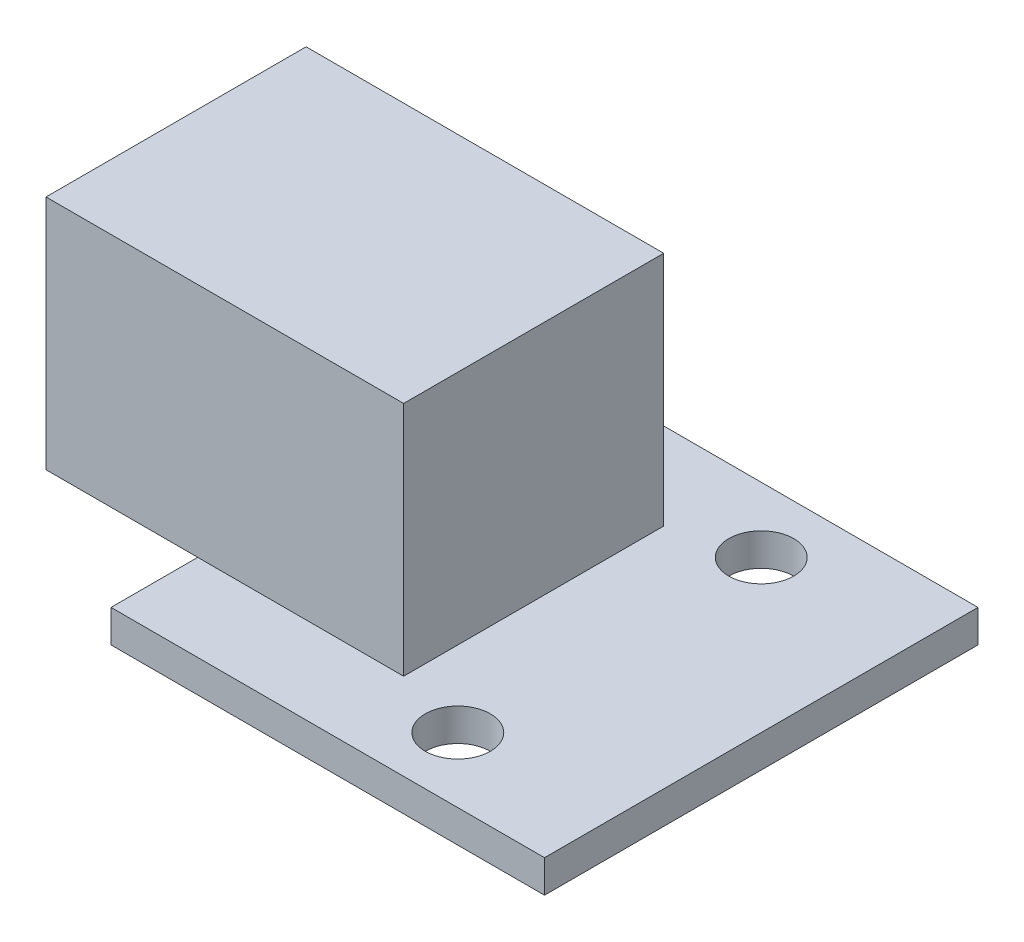
ISO-10303-21;
HEADER;
FILE_DESCRIPTION(('STEP AP214'),'2;1');
FILE_NAME('part.step','',(''),(''),'','','');
FILE_SCHEMA(('AUTOMOTIVE_DESIGN { 1 0 10303 214 1 1 1 1 }'));
ENDSEC;
DATA;
#1=APPLICATION_CONTEXT('core data for automotive mechanical design processes');
#2=APPLICATION_PROTOCOL_DEFINITION('international standard','automotive_design',2000,#1);
#3=PRODUCT_CONTEXT('',#1,'mechanical');
#4=PRODUCT('Part','Part','',(#3));
#5=PRODUCT_RELATED_PRODUCT_CATEGORY('part','',(#4));
#6=PRODUCT_DEFINITION_FORMATION('','',#4);
#7=PRODUCT_DEFINITION_CONTEXT('part definition',#1,'design');
#8=PRODUCT_DEFINITION('design','',#6,#7);
#9=PRODUCT_DEFINITION_SHAPE('','',#8);
#10=(LENGTH_UNIT() NAMED_UNIT(*) SI_UNIT(.MILLI.,.METRE.));
#11=(NAMED_UNIT(*) PLANE_ANGLE_UNIT() SI_UNIT($,.RADIAN.));
#12=(NAMED_UNIT(*) SI_UNIT($,.STERADIAN.) SOLID_ANGLE_UNIT());
#13=UNCERTAINTY_MEASURE_WITH_UNIT(LENGTH_MEASURE(1.E-05),#10,'distance_accuracy_value','');
#14=(GEOMETRIC_REPRESENTATION_CONTEXT(3) GLOBAL_UNCERTAINTY_ASSIGNED_CONTEXT((#13)) GLOBAL_UNIT_ASSIGNED_CONTEXT((#10,
#11,#12)) REPRESENTATION_CONTEXT('',''));
#15=CARTESIAN_POINT('',(0.,0.,0.));
#16=DIRECTION('',(0.,0.,1.));
#17=DIRECTION('',(1.,0.,0.));
#18=AXIS2_PLACEMENT_3D('',#15,#16,#17);
#19=CARTESIAN_POINT('',(0.,1.5,0.));
#20=DIRECTION('',(0.,-1.,0.));
#21=DIRECTION('',(0.,0.,-1.));
#22=AXIS2_PLACEMENT_3D('',#19,#20,#21);
#23=PLANE('',#22);
#24=CARTESIAN_POINT('',(3.,1.5,7.));
#25=DIRECTION('',(0.,1.,0.));
#26=DIRECTION('',(0.,0.,1.));
#27=AXIS2_PLACEMENT_3D('',#24,#25,#26);
#28=CIRCLE('',#27,1.5);
#29=CARTESIAN_POINT('',(3.,1.5,8.5));
#30=VERTEX_POINT('',#29);
#31=EDGE_CURVE('E128',#30,#30,#28,.T.);
#32=ORIENTED_EDGE('',*,*,#31,.F.);
#33=EDGE_LOOP('',(#32));
#34=FACE_BOUND('',#33,.T.);
#35=CARTESIAN_POINT('',(3.,1.5,-7.));
#36=DIRECTION('',(0.,1.,0.));
#37=DIRECTION('',(0.,0.,1.));
#38=AXIS2_PLACEMENT_3D('',#35,#36,#37);
#39=CIRCLE('',#38,1.5);
#40=CARTESIAN_POINT('',(3.,1.5,-5.5));
#41=VERTEX_POINT('',#40);
#42=EDGE_CURVE('E137',#41,#41,#39,.T.);
#43=ORIENTED_EDGE('',*,*,#42,.F.);
#44=EDGE_LOOP('',(#43));
#45=FACE_BOUND('',#44,.T.);
#46=DIRECTION('',(1.,0.,0.));
#47=VECTOR('',#46,1.);
#48=CARTESIAN_POINT('',(-17.,1.5,6.));
#49=LINE('',#48,#47);
#50=CARTESIAN_POINT('',(-10.,1.5,6.));
#51=VERTEX_POINT('',#50);
#52=CARTESIAN_POINT('',(-0.5,1.5,6.));
#53=VERTEX_POINT('',#52);
#54=EDGE_CURVE('E11',#51,#53,#49,.T.);
#55=ORIENTED_EDGE('',*,*,#54,.F.);
#56=DIRECTION('',(0.,0.,1.));
#57=VECTOR('',#56,1.);
#58=CARTESIAN_POINT('',(-10.,1.5,10.));
#59=LINE('',#58,#57);
#60=CARTESIAN_POINT('',(-10.,1.5,10.));
#61=VERTEX_POINT('',#60);
#62=EDGE_CURVE('E149',#51,#61,#59,.T.);
#63=ORIENTED_EDGE('',*,*,#62,.T.);
#64=DIRECTION('',(1.,0.,0.));
#65=VECTOR('',#64,1.);
#66=CARTESIAN_POINT('',(-10.,1.5,10.));
#67=LINE('',#66,#65);
#68=CARTESIAN_POINT('',(10.,1.5,10.));
#69=VERTEX_POINT('',#68);
#70=EDGE_CURVE('E152',#61,#69,#67,.T.);
#71=ORIENTED_EDGE('',*,*,#70,.T.);
#72=DIRECTION('',(0.,0.,-1.));
#73=VECTOR('',#72,1.);
#74=CARTESIAN_POINT('',(10.,1.5,10.));
#75=LINE('',#74,#73);
#76=CARTESIAN_POINT('',(10.,1.5,-10.));
#77=VERTEX_POINT('',#76);
#78=EDGE_CURVE('E143',#69,#77,#75,.T.);
#79=ORIENTED_EDGE('',*,*,#78,.T.);
#80=DIRECTION('',(-1.,0.,0.));
#81=VECTOR('',#80,1.);
#82=CARTESIAN_POINT('',(-10.,1.5,-10.));
#83=LINE('',#82,#81);
#84=CARTESIAN_POINT('',(-10.,1.5,-10.));
#85=VERTEX_POINT('',#84);
#86=EDGE_CURVE('E146',#77,#85,#83,.T.);
#87=ORIENTED_EDGE('',*,*,#86,.T.);
#88=CARTESIAN_POINT('',(-10.,1.5,-6.));
#89=VERTEX_POINT('',#88);
#90=EDGE_CURVE('E150',#85,#89,#59,.T.);
#91=ORIENTED_EDGE('',*,*,#90,.T.);
#92=DIRECTION('',(-1.,0.,0.));
#93=VECTOR('',#92,1.);
#94=CARTESIAN_POINT('',(-17.,1.5,-6.));
#95=LINE('',#94,#93);
#96=CARTESIAN_POINT('',(-0.5,1.5,-6.));
#97=VERTEX_POINT('',#96);
#98=EDGE_CURVE('E55',#97,#89,#95,.T.);
#99=ORIENTED_EDGE('',*,*,#98,.F.);
#100=DIRECTION('',(0.,0.,-1.));
#101=VECTOR('',#100,1.);
#102=CARTESIAN_POINT('',(-0.5,1.5,6.));
#103=LINE('',#102,#101);
#104=EDGE_CURVE('E51',#53,#97,#103,.T.);
#105=ORIENTED_EDGE('',*,*,#104,.F.);
#106=EDGE_LOOP('',(#55,#63,#71,#79,#87,#91,#99,#105));
#107=FACE_BOUND('',#106,.T.);
#108=ADVANCED_FACE('F34',(#34,#45,#107),#23,.F.);
#109=CARTESIAN_POINT('',(0.,0.,0.));
#110=DIRECTION('',(0.,-1.,0.));
#111=DIRECTION('',(0.,0.,-1.));
#112=AXIS2_PLACEMENT_3D('',#109,#110,#111);
#113=PLANE('',#112);
#114=CARTESIAN_POINT('',(3.,0.,-7.));
#115=DIRECTION('',(0.,1.,0.));
#116=DIRECTION('',(0.,0.,1.));
#117=AXIS2_PLACEMENT_3D('',#114,#115,#116);
#118=CIRCLE('',#117,1.5);
#119=CARTESIAN_POINT('',(3.,0.,-5.5));
#120=VERTEX_POINT('',#119);
#121=EDGE_CURVE('E135',#120,#120,#118,.T.);
#122=ORIENTED_EDGE('',*,*,#121,.T.);
#123=EDGE_LOOP('',(#122));
#124=FACE_BOUND('',#123,.T.);
#125=DIRECTION('',(0.,0.,-1.));
#126=VECTOR('',#125,1.);
#127=CARTESIAN_POINT('',(10.,0.,10.));
#128=LINE('',#127,#126);
#129=CARTESIAN_POINT('',(10.,0.,10.));
#130=VERTEX_POINT('',#129);
#131=CARTESIAN_POINT('',(10.,0.,-10.));
#132=VERTEX_POINT('',#131);
#133=EDGE_CURVE('E140',#130,#132,#128,.T.);
#134=ORIENTED_EDGE('',*,*,#133,.F.);
#135=DIRECTION('',(1.,0.,0.));
#136=VECTOR('',#135,1.);
#137=CARTESIAN_POINT('',(-10.,0.,10.));
#138=LINE('',#137,#136);
#139=CARTESIAN_POINT('',(-10.,0.,10.));
#140=VERTEX_POINT('',#139);
#141=EDGE_CURVE('E147',#140,#130,#138,.T.);
#142=ORIENTED_EDGE('',*,*,#141,.F.);
#143=DIRECTION('',(0.,0.,1.));
#144=VECTOR('',#143,1.);
#145=CARTESIAN_POINT('',(-10.,0.,10.));
#146=LINE('',#145,#144);
#147=CARTESIAN_POINT('',(-10.,0.,-10.));
#148=VERTEX_POINT('',#147);
#149=EDGE_CURVE('E160',#148,#140,#146,.T.);
#150=ORIENTED_EDGE('',*,*,#149,.F.);
#151=DIRECTION('',(-1.,0.,0.));
#152=VECTOR('',#151,1.);
#153=CARTESIAN_POINT('',(-10.,0.,-10.));
#154=LINE('',#153,#152);
#155=EDGE_CURVE('E158',#132,#148,#154,.T.);
#156=ORIENTED_EDGE('',*,*,#155,.F.);
#157=EDGE_LOOP('',(#134,#142,#150,#156));
#158=FACE_BOUND('',#157,.T.);
#159=CARTESIAN_POINT('',(3.,0.,7.));
#160=DIRECTION('',(0.,1.,0.));
#161=DIRECTION('',(0.,0.,1.));
#162=AXIS2_PLACEMENT_3D('',#159,#160,#161);
#163=CIRCLE('',#162,1.5);
#164=CARTESIAN_POINT('',(3.,0.,8.5));
#165=VERTEX_POINT('',#164);
#166=EDGE_CURVE('E125',#165,#165,#163,.T.);
#167=ORIENTED_EDGE('',*,*,#166,.T.);
#168=EDGE_LOOP('',(#167));
#169=FACE_BOUND('',#168,.T.);
#170=ADVANCED_FACE('F183',(#124,#158,#169),#113,.T.);
#171=CARTESIAN_POINT('',(10.,1.5,10.));
#172=DIRECTION('',(-1.,0.,0.));
#173=DIRECTION('',(0.,0.,1.));
#174=AXIS2_PLACEMENT_3D('',#171,#172,#173);
#175=PLANE('',#174);
#176=ORIENTED_EDGE('',*,*,#133,.T.);
#177=DIRECTION('',(0.,-1.,0.));
#178=VECTOR('',#177,1.);
#179=CARTESIAN_POINT('',(10.,1.5,-10.));
#180=LINE('',#179,#178);
#181=EDGE_CURVE('E38',#77,#132,#180,.T.);
#182=ORIENTED_EDGE('',*,*,#181,.F.);
#183=ORIENTED_EDGE('',*,*,#78,.F.);
#184=DIRECTION('',(0.,-1.,0.));
#185=VECTOR('',#184,1.);
#186=CARTESIAN_POINT('',(10.,1.5,10.));
#187=LINE('',#186,#185);
#188=EDGE_CURVE('E155',#69,#130,#187,.T.);
#189=ORIENTED_EDGE('',*,*,#188,.T.);
#190=EDGE_LOOP('',(#176,#182,#183,#189));
#191=FACE_BOUND('',#190,.T.);
#192=ADVANCED_FACE('F36',(#191),#175,.F.);
#193=CARTESIAN_POINT('',(-10.,1.5,-10.));
#194=DIRECTION('',(0.,0.,1.));
#195=DIRECTION('',(1.,0.,0.));
#196=AXIS2_PLACEMENT_3D('',#193,#194,#195);
#197=PLANE('',#196);
#198=ORIENTED_EDGE('',*,*,#155,.T.);
#199=DIRECTION('',(0.,-1.,0.));
#200=VECTOR('',#199,1.);
#201=CARTESIAN_POINT('',(-10.,1.5,-10.));
#202=LINE('',#201,#200);
#203=EDGE_CURVE('E167',#85,#148,#202,.T.);
#204=ORIENTED_EDGE('',*,*,#203,.F.);
#205=ORIENTED_EDGE('',*,*,#86,.F.);
#206=ORIENTED_EDGE('',*,*,#181,.T.);
#207=EDGE_LOOP('',(#198,#204,#205,#206));
#208=FACE_BOUND('',#207,.T.);
#209=ADVANCED_FACE('F176',(#208),#197,.F.);
#210=CARTESIAN_POINT('',(-10.,1.5,10.));
#211=DIRECTION('',(1.,0.,0.));
#212=DIRECTION('',(0.,0.,-1.));
#213=AXIS2_PLACEMENT_3D('',#210,#211,#212);
#214=PLANE('',#213);
#215=ORIENTED_EDGE('',*,*,#149,.T.);
#216=DIRECTION('',(0.,-1.,0.));
#217=VECTOR('',#216,1.);
#218=CARTESIAN_POINT('',(-10.,1.5,10.));
#219=LINE('',#218,#217);
#220=EDGE_CURVE('E165',#61,#140,#219,.T.);
#221=ORIENTED_EDGE('',*,*,#220,.F.);
#222=ORIENTED_EDGE('',*,*,#62,.F.);
#223=EDGE_CURVE('E153',#89,#51,#59,.T.);
#224=ORIENTED_EDGE('',*,*,#223,.F.);
#225=ORIENTED_EDGE('',*,*,#90,.F.);
#226=ORIENTED_EDGE('',*,*,#203,.T.);
#227=EDGE_LOOP('',(#215,#221,#222,#224,#225,#226));
#228=FACE_BOUND('',#227,.T.);
#229=ADVANCED_FACE('F186',(#228),#214,.F.);
#230=CARTESIAN_POINT('',(-10.,1.5,10.));
#231=DIRECTION('',(0.,0.,-1.));
#232=DIRECTION('',(-1.,0.,0.));
#233=AXIS2_PLACEMENT_3D('',#230,#231,#232);
#234=PLANE('',#233);
#235=ORIENTED_EDGE('',*,*,#141,.T.);
#236=ORIENTED_EDGE('',*,*,#188,.F.);
#237=ORIENTED_EDGE('',*,*,#70,.F.);
#238=ORIENTED_EDGE('',*,*,#220,.T.);
#239=EDGE_LOOP('',(#235,#236,#237,#238));
#240=FACE_BOUND('',#239,.T.);
#241=ADVANCED_FACE('F190',(#240),#234,.F.);
#242=CARTESIAN_POINT('',(3.,1.5,-7.));
#243=DIRECTION('',(0.,-1.,0.));
#244=DIRECTION('',(0.,0.,-1.));
#245=AXIS2_PLACEMENT_3D('',#242,#243,#244);
#246=CYLINDRICAL_SURFACE('',#245,1.5);
#247=ORIENTED_EDGE('',*,*,#42,.T.);
#248=EDGE_LOOP('',(#247));
#249=FACE_BOUND('',#248,.T.);
#250=ORIENTED_EDGE('',*,*,#121,.F.);
#251=EDGE_LOOP('',(#250));
#252=FACE_BOUND('',#251,.T.);
#253=ADVANCED_FACE('F233',(#249,#252),#246,.F.);
#254=CARTESIAN_POINT('',(3.,1.5,7.));
#255=DIRECTION('',(0.,-1.,0.));
#256=DIRECTION('',(0.,0.,-1.));
#257=AXIS2_PLACEMENT_3D('',#254,#255,#256);
#258=CYLINDRICAL_SURFACE('',#257,1.5);
#259=ORIENTED_EDGE('',*,*,#31,.T.);
#260=EDGE_LOOP('',(#259));
#261=FACE_BOUND('',#260,.T.);
#262=ORIENTED_EDGE('',*,*,#166,.F.);
#263=EDGE_LOOP('',(#262));
#264=FACE_BOUND('',#263,.T.);
#265=ADVANCED_FACE('F276',(#261,#264),#258,.F.);
#266=CARTESIAN_POINT('',(-0.5,12.4,6.));
#267=DIRECTION('',(-1.,0.,0.));
#268=DIRECTION('',(0.,0.,1.));
#269=AXIS2_PLACEMENT_3D('',#266,#267,#268);
#270=PLANE('',#269);
#271=ORIENTED_EDGE('',*,*,#104,.T.);
#272=DIRECTION('',(0.,-1.,0.));
#273=VECTOR('',#272,1.);
#274=CARTESIAN_POINT('',(-0.5,12.4,-6.));
#275=LINE('',#274,#273);
#276=CARTESIAN_POINT('',(-0.5,12.4,-6.));
#277=VERTEX_POINT('',#276);
#278=EDGE_CURVE('E108',#277,#97,#275,.T.);
#279=ORIENTED_EDGE('',*,*,#278,.F.);
#280=DIRECTION('',(0.,0.,-1.));
#281=VECTOR('',#280,1.);
#282=CARTESIAN_POINT('',(-0.5,12.4,6.));
#283=LINE('',#282,#281);
#284=CARTESIAN_POINT('',(-0.5,12.4,6.));
#285=VERTEX_POINT('',#284);
#286=EDGE_CURVE('E114',#285,#277,#283,.T.);
#287=ORIENTED_EDGE('',*,*,#286,.F.);
#288=DIRECTION('',(0.,-1.,0.));
#289=VECTOR('',#288,1.);
#290=CARTESIAN_POINT('',(-0.5,12.4,6.));
#291=LINE('',#290,#289);
#292=EDGE_CURVE('E208',#285,#53,#291,.T.);
#293=ORIENTED_EDGE('',*,*,#292,.T.);
#294=EDGE_LOOP('',(#271,#279,#287,#293));
#295=FACE_BOUND('',#294,.T.);
#296=ADVANCED_FACE('F124',(#295),#270,.F.);
#297=CARTESIAN_POINT('',(-17.,12.4,-6.));
#298=DIRECTION('',(0.,0.,1.));
#299=DIRECTION('',(1.,0.,0.));
#300=AXIS2_PLACEMENT_3D('',#297,#298,#299);
#301=PLANE('',#300);
#302=ORIENTED_EDGE('',*,*,#98,.T.);
#303=CARTESIAN_POINT('',(-17.,1.5,-6.));
#304=VERTEX_POINT('',#303);
#305=EDGE_CURVE('E199',#89,#304,#95,.T.);
#306=ORIENTED_EDGE('',*,*,#305,.T.);
#307=DIRECTION('',(0.,-1.,0.));
#308=VECTOR('',#307,1.);
#309=CARTESIAN_POINT('',(-17.,12.4,-6.));
#310=LINE('',#309,#308);
#311=CARTESIAN_POINT('',(-17.,12.4,-6.));
#312=VERTEX_POINT('',#311);
#313=EDGE_CURVE('E110',#312,#304,#310,.T.);
#314=ORIENTED_EDGE('',*,*,#313,.F.);
#315=DIRECTION('',(-1.,0.,0.));
#316=VECTOR('',#315,1.);
#317=CARTESIAN_POINT('',(-17.,12.4,-6.));
#318=LINE('',#317,#316);
#319=EDGE_CURVE('E104',#277,#312,#318,.T.);
#320=ORIENTED_EDGE('',*,*,#319,.F.);
#321=ORIENTED_EDGE('',*,*,#278,.T.);
#322=EDGE_LOOP('',(#302,#306,#314,#320,#321));
#323=FACE_BOUND('',#322,.T.);
#324=ADVANCED_FACE('F106',(#323),#301,.F.);
#325=CARTESIAN_POINT('',(-17.,12.4,6.));
#326=DIRECTION('',(1.,0.,0.));
#327=DIRECTION('',(0.,0.,-1.));
#328=AXIS2_PLACEMENT_3D('',#325,#326,#327);
#329=PLANE('',#328);
#330=DIRECTION('',(0.,0.,1.));
#331=VECTOR('',#330,1.);
#332=CARTESIAN_POINT('',(-17.,1.5,6.));
#333=LINE('',#332,#331);
#334=CARTESIAN_POINT('',(-17.,1.5,6.));
#335=VERTEX_POINT('',#334);
#336=EDGE_CURVE('E204',#304,#335,#333,.T.);
#337=ORIENTED_EDGE('',*,*,#336,.T.);
#338=DIRECTION('',(0.,-1.,0.));
#339=VECTOR('',#338,1.);
#340=CARTESIAN_POINT('',(-17.,12.4,6.));
#341=LINE('',#340,#339);
#342=CARTESIAN_POINT('',(-17.,12.4,6.));
#343=VERTEX_POINT('',#342);
#344=EDGE_CURVE('E130',#343,#335,#341,.T.);
#345=ORIENTED_EDGE('',*,*,#344,.F.);
#346=DIRECTION('',(0.,0.,1.));
#347=VECTOR('',#346,1.);
#348=CARTESIAN_POINT('',(-17.,12.4,6.));
#349=LINE('',#348,#347);
#350=EDGE_CURVE('E113',#312,#343,#349,.T.);
#351=ORIENTED_EDGE('',*,*,#350,.F.);
#352=ORIENTED_EDGE('',*,*,#313,.T.);
#353=EDGE_LOOP('',(#337,#345,#351,#352));
#354=FACE_BOUND('',#353,.T.);
#355=ADVANCED_FACE('F213',(#354),#329,.F.);
#356=CARTESIAN_POINT('',(-17.,12.4,6.));
#357=DIRECTION('',(0.,0.,-1.));
#358=DIRECTION('',(-1.,0.,0.));
#359=AXIS2_PLACEMENT_3D('',#356,#357,#358);
#360=PLANE('',#359);
#361=EDGE_CURVE('E44',#335,#51,#49,.T.);
#362=ORIENTED_EDGE('',*,*,#361,.T.);
#363=ORIENTED_EDGE('',*,*,#54,.T.);
#364=ORIENTED_EDGE('',*,*,#292,.F.);
#365=DIRECTION('',(1.,0.,0.));
#366=VECTOR('',#365,1.);
#367=CARTESIAN_POINT('',(-17.,12.4,6.));
#368=LINE('',#367,#366);
#369=EDGE_CURVE('E119',#343,#285,#368,.T.);
#370=ORIENTED_EDGE('',*,*,#369,.F.);
#371=ORIENTED_EDGE('',*,*,#344,.T.);
#372=EDGE_LOOP('',(#362,#363,#364,#370,#371));
#373=FACE_BOUND('',#372,.T.);
#374=ADVANCED_FACE('F202',(#373),#360,.F.);
#375=CARTESIAN_POINT('',(0.,12.4,0.));
#376=DIRECTION('',(0.,-1.,0.));
#377=DIRECTION('',(0.,0.,-1.));
#378=AXIS2_PLACEMENT_3D('',#375,#376,#377);
#379=PLANE('',#378);
#380=ORIENTED_EDGE('',*,*,#286,.T.);
#381=ORIENTED_EDGE('',*,*,#319,.T.);
#382=ORIENTED_EDGE('',*,*,#350,.T.);
#383=ORIENTED_EDGE('',*,*,#369,.T.);
#384=EDGE_LOOP('',(#380,#381,#382,#383));
#385=FACE_BOUND('',#384,.T.);
#386=ADVANCED_FACE('F117',(#385),#379,.F.);
#387=CARTESIAN_POINT('',(0.,1.5,0.));
#388=DIRECTION('',(0.,-1.,0.));
#389=DIRECTION('',(0.,0.,-1.));
#390=AXIS2_PLACEMENT_3D('',#387,#388,#389);
#391=PLANE('',#390);
#392=ORIENTED_EDGE('',*,*,#305,.F.);
#393=ORIENTED_EDGE('',*,*,#223,.T.);
#394=ORIENTED_EDGE('',*,*,#361,.F.);
#395=ORIENTED_EDGE('',*,*,#336,.F.);
#396=EDGE_LOOP('',(#392,#393,#394,#395));
#397=FACE_BOUND('',#396,.T.);
#398=ADVANCED_FACE('F197',(#397),#391,.T.);
#399=CLOSED_SHELL('',(#108,#170,#192,#209,#229,#241,#253,#265,#296,#324,#355,#374,#386,#398));
#400=MANIFOLD_SOLID_BREP('B2',#399);
#401=ADVANCED_BREP_SHAPE_REPRESENTATION('',(#18,#400),#14);
#402=SHAPE_DEFINITION_REPRESENTATION(#9,#401);
ENDSEC;
END-ISO-10303-21;
